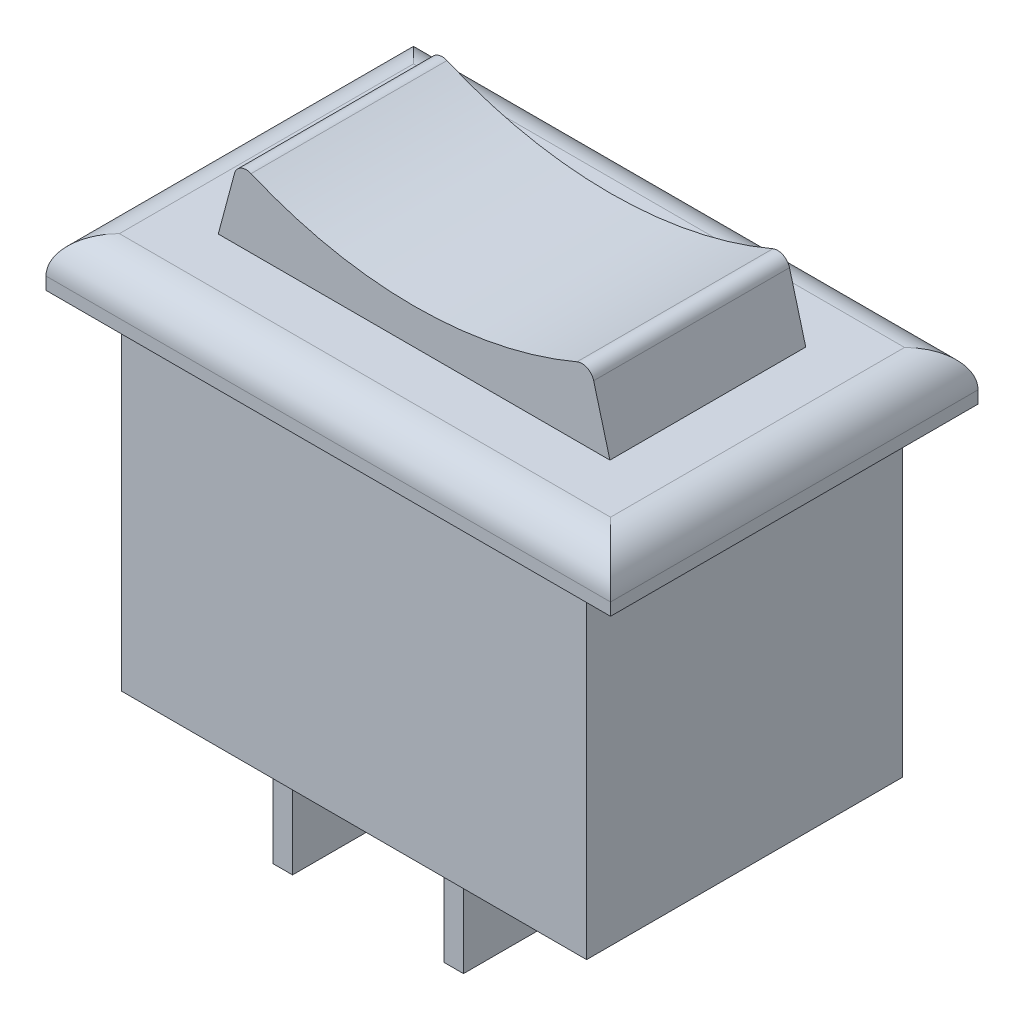
ISO-10303-21;
HEADER;
FILE_DESCRIPTION(('STEP AP214'),'2;1');
FILE_NAME('part.step','',(''),(''),'','','');
FILE_SCHEMA(('AUTOMOTIVE_DESIGN { 1 0 10303 214 1 1 1 1 }'));
ENDSEC;
DATA;
#1=APPLICATION_CONTEXT('core data for automotive mechanical design processes');
#2=APPLICATION_PROTOCOL_DEFINITION('international standard','automotive_design',2000,#1);
#3=PRODUCT_CONTEXT('',#1,'mechanical');
#4=PRODUCT('Part','Part','',(#3));
#5=PRODUCT_RELATED_PRODUCT_CATEGORY('part','',(#4));
#6=PRODUCT_DEFINITION_FORMATION('','',#4);
#7=PRODUCT_DEFINITION_CONTEXT('part definition',#1,'design');
#8=PRODUCT_DEFINITION('design','',#6,#7);
#9=PRODUCT_DEFINITION_SHAPE('','',#8);
#10=(LENGTH_UNIT() NAMED_UNIT(*) SI_UNIT(.MILLI.,.METRE.));
#11=(NAMED_UNIT(*) PLANE_ANGLE_UNIT() SI_UNIT($,.RADIAN.));
#12=(NAMED_UNIT(*) SI_UNIT($,.STERADIAN.) SOLID_ANGLE_UNIT());
#13=UNCERTAINTY_MEASURE_WITH_UNIT(LENGTH_MEASURE(1.E-05),#10,'distance_accuracy_value','');
#14=(GEOMETRIC_REPRESENTATION_CONTEXT(3) GLOBAL_UNCERTAINTY_ASSIGNED_CONTEXT((#13)) GLOBAL_UNIT_ASSIGNED_CONTEXT((#10,
#11,#12)) REPRESENTATION_CONTEXT('',''));
#15=CARTESIAN_POINT('',(0.,0.,0.));
#16=DIRECTION('',(0.,0.,1.));
#17=DIRECTION('',(1.,0.,0.));
#18=AXIS2_PLACEMENT_3D('',#15,#16,#17);
#19=CARTESIAN_POINT('',(0.,0.,15.0114));
#20=DIRECTION('',(1.,0.,0.));
#21=DIRECTION('',(0.,1.,0.));
#22=AXIS2_PLACEMENT_3D('',#19,#20,#21);
#23=PLANE('',#22);
#24=DIRECTION('',(0.,0.,-1.));
#25=VECTOR('',#24,1.);
#26=CARTESIAN_POINT('',(0.,0.,15.0114));
#27=LINE('',#26,#25);
#28=CARTESIAN_POINT('',(0.,0.,13.9573));
#29=VERTEX_POINT('',#28);
#30=CARTESIAN_POINT('',(0.,0.,1.0541));
#31=VERTEX_POINT('',#30);
#32=EDGE_CURVE('E329',#29,#31,#27,.T.);
#33=ORIENTED_EDGE('',*,*,#32,.T.);
#34=DIRECTION('',(0.,-1.,0.));
#35=VECTOR('',#34,1.);
#36=CARTESIAN_POINT('',(0.,0.,1.0541));
#37=LINE('',#36,#35);
#38=CARTESIAN_POINT('',(0.,-13.6906,1.0541));
#39=VERTEX_POINT('',#38);
#40=EDGE_CURVE('E306',#31,#39,#37,.T.);
#41=ORIENTED_EDGE('',*,*,#40,.T.);
#42=DIRECTION('',(0.,0.,-1.));
#43=VECTOR('',#42,1.);
#44=CARTESIAN_POINT('',(0.,-13.6906,15.0114));
#45=LINE('',#44,#43);
#46=CARTESIAN_POINT('',(0.,-13.6906,13.9573));
#47=VERTEX_POINT('',#46);
#48=EDGE_CURVE('E348',#47,#39,#45,.T.);
#49=ORIENTED_EDGE('',*,*,#48,.F.);
#50=DIRECTION('',(0.,1.,0.));
#51=VECTOR('',#50,1.);
#52=CARTESIAN_POINT('',(0.,0.,13.9573));
#53=LINE('',#52,#51);
#54=EDGE_CURVE('E317',#47,#29,#53,.T.);
#55=ORIENTED_EDGE('',*,*,#54,.T.);
#56=EDGE_LOOP('',(#33,#41,#49,#55));
#57=FACE_BOUND('',#56,.T.);
#58=ADVANCED_FACE('F33',(#57),#23,.F.);
#59=CARTESIAN_POINT('',(0.,-13.6906,15.0114));
#60=DIRECTION('',(0.,1.,0.));
#61=DIRECTION('',(0.,0.,1.));
#62=AXIS2_PLACEMENT_3D('',#59,#60,#61);
#63=PLANE('',#62);
#64=DIRECTION('',(-1.,0.,0.));
#65=VECTOR('',#64,1.);
#66=CARTESIAN_POINT('',(21.0312,-13.6906,9.8806));
#67=LINE('',#66,#65);
#68=CARTESIAN_POINT('',(9.8933,-13.6906,9.8806));
#69=VERTEX_POINT('',#68);
#70=CARTESIAN_POINT('',(9.1059,-13.6906,9.8806));
#71=VERTEX_POINT('',#70);
#72=EDGE_CURVE('E249',#69,#71,#67,.T.);
#73=ORIENTED_EDGE('',*,*,#72,.F.);
#74=DIRECTION('',(0.,0.,1.));
#75=VECTOR('',#74,1.);
#76=CARTESIAN_POINT('',(9.8933,-13.6906,-6.0761102577694));
#77=LINE('',#76,#75);
#78=CARTESIAN_POINT('',(9.8933,-13.6906,5.1308));
#79=VERTEX_POINT('',#78);
#80=EDGE_CURVE('E277',#79,#69,#77,.T.);
#81=ORIENTED_EDGE('',*,*,#80,.F.);
#82=DIRECTION('',(-1.,0.,0.));
#83=VECTOR('',#82,1.);
#84=CARTESIAN_POINT('',(21.0312,-13.6906,5.1308));
#85=LINE('',#84,#83);
#86=CARTESIAN_POINT('',(9.1059,-13.6906,5.1308));
#87=VERTEX_POINT('',#86);
#88=EDGE_CURVE('E262',#79,#87,#85,.T.);
#89=ORIENTED_EDGE('',*,*,#88,.T.);
#90=DIRECTION('',(0.,0.,1.));
#91=VECTOR('',#90,1.);
#92=CARTESIAN_POINT('',(9.1059,-13.6906,-6.0761102577694));
#93=LINE('',#92,#91);
#94=EDGE_CURVE('E273',#87,#71,#93,.T.);
#95=ORIENTED_EDGE('',*,*,#94,.T.);
#96=EDGE_LOOP('',(#73,#81,#89,#95));
#97=FACE_BOUND('',#96,.T.);
#98=CARTESIAN_POINT('',(2.9083,-13.6906,9.8806));
#99=VERTEX_POINT('',#98);
#100=CARTESIAN_POINT('',(2.1209,-13.6906,9.8806));
#101=VERTEX_POINT('',#100);
#102=EDGE_CURVE('E237',#99,#101,#67,.T.);
#103=ORIENTED_EDGE('',*,*,#102,.F.);
#104=DIRECTION('',(0.,0.,1.));
#105=VECTOR('',#104,1.);
#106=CARTESIAN_POINT('',(2.9083,-13.6906,-6.0761102577694));
#107=LINE('',#106,#105);
#108=CARTESIAN_POINT('',(2.9083,-13.6906,5.1308));
#109=VERTEX_POINT('',#108);
#110=EDGE_CURVE('E289',#109,#99,#107,.T.);
#111=ORIENTED_EDGE('',*,*,#110,.F.);
#112=CARTESIAN_POINT('',(2.1209,-13.6906,5.1308));
#113=VERTEX_POINT('',#112);
#114=EDGE_CURVE('E259',#109,#113,#85,.T.);
#115=ORIENTED_EDGE('',*,*,#114,.T.);
#116=DIRECTION('',(0.,0.,1.));
#117=VECTOR('',#116,1.);
#118=CARTESIAN_POINT('',(2.1209,-13.6906,-6.0761102577694));
#119=LINE('',#118,#117);
#120=EDGE_CURVE('E285',#113,#101,#119,.T.);
#121=ORIENTED_EDGE('',*,*,#120,.T.);
#122=EDGE_LOOP('',(#103,#111,#115,#121));
#123=FACE_BOUND('',#122,.T.);
#124=DIRECTION('',(1.,0.,0.));
#125=VECTOR('',#124,1.);
#126=CARTESIAN_POINT('',(-2.032,-13.6906,1.0541));
#127=LINE('',#126,#125);
#128=CARTESIAN_POINT('',(18.9992,-13.6906,1.0541));
#129=VERTEX_POINT('',#128);
#130=EDGE_CURVE('E297',#39,#129,#127,.T.);
#131=ORIENTED_EDGE('',*,*,#130,.T.);
#132=DIRECTION('',(0.,0.,-1.));
#133=VECTOR('',#132,1.);
#134=CARTESIAN_POINT('',(18.9992,-13.6906,15.0114));
#135=LINE('',#134,#133);
#136=CARTESIAN_POINT('',(18.9992,-13.6906,13.9573));
#137=VERTEX_POINT('',#136);
#138=EDGE_CURVE('E346',#137,#129,#135,.T.);
#139=ORIENTED_EDGE('',*,*,#138,.F.);
#140=DIRECTION('',(1.,0.,0.));
#141=VECTOR('',#140,1.);
#142=CARTESIAN_POINT('',(-2.032,-13.6906,13.9573));
#143=LINE('',#142,#141);
#144=EDGE_CURVE('E309',#47,#137,#143,.T.);
#145=ORIENTED_EDGE('',*,*,#144,.F.);
#146=ORIENTED_EDGE('',*,*,#48,.T.);
#147=EDGE_LOOP('',(#131,#139,#145,#146));
#148=FACE_BOUND('',#147,.T.);
#149=ADVANCED_FACE('F398',(#97,#123,#148),#63,.F.);
#150=CARTESIAN_POINT('',(18.9992,0.,15.0114));
#151=DIRECTION('',(-1.,0.,0.));
#152=DIRECTION('',(0.,0.,1.));
#153=AXIS2_PLACEMENT_3D('',#150,#151,#152);
#154=PLANE('',#153);
#155=ORIENTED_EDGE('',*,*,#138,.T.);
#156=DIRECTION('',(0.,1.,0.));
#157=VECTOR('',#156,1.);
#158=CARTESIAN_POINT('',(18.9992,0.,1.0541));
#159=LINE('',#158,#157);
#160=CARTESIAN_POINT('',(18.9992,0.,1.0541));
#161=VERTEX_POINT('',#160);
#162=EDGE_CURVE('E300',#129,#161,#159,.T.);
#163=ORIENTED_EDGE('',*,*,#162,.T.);
#164=DIRECTION('',(0.,0.,-1.));
#165=VECTOR('',#164,1.);
#166=CARTESIAN_POINT('',(18.9992,0.,15.0114));
#167=LINE('',#166,#165);
#168=CARTESIAN_POINT('',(18.9992,0.,13.9573));
#169=VERTEX_POINT('',#168);
#170=EDGE_CURVE('E343',#169,#161,#167,.T.);
#171=ORIENTED_EDGE('',*,*,#170,.F.);
#172=DIRECTION('',(0.,-1.,0.));
#173=VECTOR('',#172,1.);
#174=CARTESIAN_POINT('',(18.9992,0.,13.9573));
#175=LINE('',#174,#173);
#176=EDGE_CURVE('E313',#169,#137,#175,.T.);
#177=ORIENTED_EDGE('',*,*,#176,.T.);
#178=EDGE_LOOP('',(#155,#163,#171,#177));
#179=FACE_BOUND('',#178,.T.);
#180=ADVANCED_FACE('F401',(#179),#154,.F.);
#181=CARTESIAN_POINT('',(21.0312,2.0066,15.0114));
#182=DIRECTION('',(-1.,0.,0.));
#183=DIRECTION('',(0.,0.,1.));
#184=AXIS2_PLACEMENT_3D('',#181,#182,#183);
#185=PLANE('',#184);
#186=DIRECTION('',(0.,1.,0.));
#187=VECTOR('',#186,1.);
#188=CARTESIAN_POINT('',(21.0312,2.0066,0.));
#189=LINE('',#188,#187);
#190=CARTESIAN_POINT('',(21.0312,0.,0.));
#191=VERTEX_POINT('',#190);
#192=CARTESIAN_POINT('',(21.0312,0.506599999999999,0.));
#193=VERTEX_POINT('',#192);
#194=EDGE_CURVE('E320',#191,#193,#189,.T.);
#195=ORIENTED_EDGE('',*,*,#194,.T.);
#196=DIRECTION('',(0.,0.,-1.));
#197=VECTOR('',#196,1.);
#198=CARTESIAN_POINT('',(21.0312,0.506599999999998,15.0114));
#199=LINE('',#198,#197);
#200=CARTESIAN_POINT('',(21.0312,0.506599999999999,15.0114));
#201=VERTEX_POINT('',#200);
#202=EDGE_CURVE('E359',#193,#201,#199,.F.);
#203=ORIENTED_EDGE('',*,*,#202,.T.);
#204=DIRECTION('',(0.,1.,0.));
#205=VECTOR('',#204,1.);
#206=CARTESIAN_POINT('',(21.0312,2.0066,15.0114));
#207=LINE('',#206,#205);
#208=CARTESIAN_POINT('',(21.0312,0.,15.0114));
#209=VERTEX_POINT('',#208);
#210=EDGE_CURVE('E323',#209,#201,#207,.T.);
#211=ORIENTED_EDGE('',*,*,#210,.F.);
#212=DIRECTION('',(0.,0.,-1.));
#213=VECTOR('',#212,1.);
#214=CARTESIAN_POINT('',(21.0312,0.,15.0114));
#215=LINE('',#214,#213);
#216=EDGE_CURVE('E341',#209,#191,#215,.T.);
#217=ORIENTED_EDGE('',*,*,#216,.T.);
#218=EDGE_LOOP('',(#195,#203,#211,#217));
#219=FACE_BOUND('',#218,.T.);
#220=ADVANCED_FACE('F467',(#219),#185,.F.);
#221=CARTESIAN_POINT('',(21.0312,2.0066,15.0114));
#222=DIRECTION('',(0.,-1.,0.));
#223=DIRECTION('',(1.,0.,0.));
#224=AXIS2_PLACEMENT_3D('',#221,#222,#223);
#225=PLANE('',#224);
#226=DIRECTION('',(0.,0.,1.));
#227=VECTOR('',#226,1.);
#228=CARTESIAN_POINT('',(1.4996,2.00659999999999,3.5057));
#229=LINE('',#228,#227);
#230=CARTESIAN_POINT('',(1.4996,2.00659999999999,3.5057));
#231=VERTEX_POINT('',#230);
#232=CARTESIAN_POINT('',(1.4996,2.00659999999999,11.5057));
#233=VERTEX_POINT('',#232);
#234=EDGE_CURVE('E48',#231,#233,#229,.T.);
#235=ORIENTED_EDGE('',*,*,#234,.F.);
#236=DIRECTION('',(1.,0.,0.));
#237=VECTOR('',#236,1.);
#238=CARTESIAN_POINT('',(1.4996,2.00659999999999,3.5057));
#239=LINE('',#238,#237);
#240=CARTESIAN_POINT('',(17.4996,2.0066,3.5057));
#241=VERTEX_POINT('',#240);
#242=EDGE_CURVE('E52',#231,#241,#239,.T.);
#243=ORIENTED_EDGE('',*,*,#242,.T.);
#244=DIRECTION('',(0.,0.,1.));
#245=VECTOR('',#244,1.);
#246=CARTESIAN_POINT('',(17.4996,2.00659999999999,3.5057));
#247=LINE('',#246,#245);
#248=CARTESIAN_POINT('',(17.4996,2.00659999999999,11.5057));
#249=VERTEX_POINT('',#248);
#250=EDGE_CURVE('E188',#241,#249,#247,.T.);
#251=ORIENTED_EDGE('',*,*,#250,.T.);
#252=DIRECTION('',(1.,0.,0.));
#253=VECTOR('',#252,1.);
#254=CARTESIAN_POINT('',(1.4996,2.00659999999999,11.5057));
#255=LINE('',#254,#253);
#256=EDGE_CURVE('E193',#233,#249,#255,.T.);
#257=ORIENTED_EDGE('',*,*,#256,.F.);
#258=EDGE_LOOP('',(#235,#243,#251,#257));
#259=FACE_BOUND('',#258,.T.);
#260=DIRECTION('',(-1.,0.,0.));
#261=VECTOR('',#260,1.);
#262=CARTESIAN_POINT('',(21.0312,2.0066,13.5114));
#263=LINE('',#262,#261);
#264=CARTESIAN_POINT('',(-0.531999999999999,2.00659999999999,13.5114));
#265=VERTEX_POINT('',#264);
#266=CARTESIAN_POINT('',(19.5312,2.0066,13.5114));
#267=VERTEX_POINT('',#266);
#268=EDGE_CURVE('E354',#265,#267,#263,.F.);
#269=ORIENTED_EDGE('',*,*,#268,.T.);
#270=DIRECTION('',(0.,0.,-1.));
#271=VECTOR('',#270,1.);
#272=CARTESIAN_POINT('',(19.5312,2.0066,15.0114));
#273=LINE('',#272,#271);
#274=CARTESIAN_POINT('',(19.5312,2.0066,1.5));
#275=VERTEX_POINT('',#274);
#276=EDGE_CURVE('E356',#267,#275,#273,.T.);
#277=ORIENTED_EDGE('',*,*,#276,.T.);
#278=DIRECTION('',(-1.,0.,0.));
#279=VECTOR('',#278,1.);
#280=CARTESIAN_POINT('',(21.0312,2.0066,1.5));
#281=LINE('',#280,#279);
#282=CARTESIAN_POINT('',(-0.531999999999999,2.00659999999999,1.5));
#283=VERTEX_POINT('',#282);
#284=EDGE_CURVE('E350',#275,#283,#281,.T.);
#285=ORIENTED_EDGE('',*,*,#284,.T.);
#286=DIRECTION('',(0.,0.,-1.));
#287=VECTOR('',#286,1.);
#288=CARTESIAN_POINT('',(-0.531999999999998,2.00659999999999,15.0114));
#289=LINE('',#288,#287);
#290=EDGE_CURVE('E352',#283,#265,#289,.F.);
#291=ORIENTED_EDGE('',*,*,#290,.T.);
#292=EDGE_LOOP('',(#269,#277,#285,#291));
#293=FACE_BOUND('',#292,.T.);
#294=ADVANCED_FACE('F190',(#259,#293),#225,.F.);
#295=CARTESIAN_POINT('',(-2.032,2.00659999999999,15.0114));
#296=DIRECTION('',(1.,0.,0.));
#297=DIRECTION('',(0.,0.,-1.));
#298=AXIS2_PLACEMENT_3D('',#295,#296,#297);
#299=PLANE('',#298);
#300=DIRECTION('',(0.,-1.,0.));
#301=VECTOR('',#300,1.);
#302=CARTESIAN_POINT('',(-2.032,2.00659999999999,15.0114));
#303=LINE('',#302,#301);
#304=CARTESIAN_POINT('',(-2.032,0.506599999999992,15.0114));
#305=VERTEX_POINT('',#304);
#306=CARTESIAN_POINT('',(-2.032,0.,15.0114));
#307=VERTEX_POINT('',#306);
#308=EDGE_CURVE('E327',#305,#307,#303,.T.);
#309=ORIENTED_EDGE('',*,*,#308,.F.);
#310=DIRECTION('',(0.,0.,-1.));
#311=VECTOR('',#310,1.);
#312=CARTESIAN_POINT('',(-2.032,0.506599999999992,15.0114));
#313=LINE('',#312,#311);
#314=CARTESIAN_POINT('',(-2.032,0.506599999999992,0.));
#315=VERTEX_POINT('',#314);
#316=EDGE_CURVE('E364',#305,#315,#313,.T.);
#317=ORIENTED_EDGE('',*,*,#316,.T.);
#318=DIRECTION('',(0.,-1.,0.));
#319=VECTOR('',#318,1.);
#320=CARTESIAN_POINT('',(-2.032,2.00659999999999,0.));
#321=LINE('',#320,#319);
#322=CARTESIAN_POINT('',(-2.032,0.,0.));
#323=VERTEX_POINT('',#322);
#324=EDGE_CURVE('E332',#315,#323,#321,.T.);
#325=ORIENTED_EDGE('',*,*,#324,.T.);
#326=DIRECTION('',(0.,0.,-1.));
#327=VECTOR('',#326,1.);
#328=CARTESIAN_POINT('',(-2.032,0.,15.0114));
#329=LINE('',#328,#327);
#330=EDGE_CURVE('E338',#307,#323,#329,.T.);
#331=ORIENTED_EDGE('',*,*,#330,.F.);
#332=EDGE_LOOP('',(#309,#317,#325,#331));
#333=FACE_BOUND('',#332,.T.);
#334=ADVANCED_FACE('F455',(#333),#299,.F.);
#335=CARTESIAN_POINT('',(-2.032,0.,15.0114));
#336=DIRECTION('',(0.,1.,0.));
#337=DIRECTION('',(-1.,0.,0.));
#338=AXIS2_PLACEMENT_3D('',#335,#336,#337);
#339=PLANE('',#338);
#340=DIRECTION('',(1.,0.,0.));
#341=VECTOR('',#340,1.);
#342=CARTESIAN_POINT('',(-2.032,0.,1.0541));
#343=LINE('',#342,#341);
#344=EDGE_CURVE('E301',#31,#161,#343,.T.);
#345=ORIENTED_EDGE('',*,*,#344,.F.);
#346=ORIENTED_EDGE('',*,*,#32,.F.);
#347=DIRECTION('',(1.,0.,0.));
#348=VECTOR('',#347,1.);
#349=CARTESIAN_POINT('',(-2.032,0.,13.9573));
#350=LINE('',#349,#348);
#351=EDGE_CURVE('E310',#29,#169,#350,.T.);
#352=ORIENTED_EDGE('',*,*,#351,.T.);
#353=ORIENTED_EDGE('',*,*,#170,.T.);
#354=EDGE_LOOP('',(#345,#346,#352,#353));
#355=FACE_BOUND('',#354,.T.);
#356=ORIENTED_EDGE('',*,*,#330,.T.);
#357=DIRECTION('',(1.,0.,0.));
#358=VECTOR('',#357,1.);
#359=CARTESIAN_POINT('',(-2.032,0.,0.));
#360=LINE('',#359,#358);
#361=EDGE_CURVE('E324',#323,#191,#360,.T.);
#362=ORIENTED_EDGE('',*,*,#361,.T.);
#363=ORIENTED_EDGE('',*,*,#216,.F.);
#364=DIRECTION('',(1.,0.,0.));
#365=VECTOR('',#364,1.);
#366=CARTESIAN_POINT('',(21.0312,0.,15.0114));
#367=LINE('',#366,#365);
#368=EDGE_CURVE('E321',#307,#209,#367,.T.);
#369=ORIENTED_EDGE('',*,*,#368,.F.);
#370=EDGE_LOOP('',(#356,#362,#363,#369));
#371=FACE_BOUND('',#370,.T.);
#372=ADVANCED_FACE('F417',(#355,#371),#339,.F.);
#373=CARTESIAN_POINT('',(0.,0.,15.0114));
#374=DIRECTION('',(0.,0.,1.));
#375=DIRECTION('',(1.,0.,0.));
#376=AXIS2_PLACEMENT_3D('',#373,#374,#375);
#377=PLANE('',#376);
#378=ORIENTED_EDGE('',*,*,#210,.T.);
#379=DIRECTION('',(-1.,0.,0.));
#380=VECTOR('',#379,1.);
#381=CARTESIAN_POINT('',(-2.032,0.506599999999992,15.0114));
#382=LINE('',#381,#380);
#383=EDGE_CURVE('E362',#201,#305,#382,.T.);
#384=ORIENTED_EDGE('',*,*,#383,.T.);
#385=ORIENTED_EDGE('',*,*,#308,.T.);
#386=ORIENTED_EDGE('',*,*,#368,.T.);
#387=EDGE_LOOP('',(#378,#384,#385,#386));
#388=FACE_BOUND('',#387,.T.);
#389=ADVANCED_FACE('F465',(#388),#377,.T.);
#390=CARTESIAN_POINT('',(0.,0.,0.));
#391=DIRECTION('',(0.,0.,1.));
#392=DIRECTION('',(1.,0.,0.));
#393=AXIS2_PLACEMENT_3D('',#390,#391,#392);
#394=PLANE('',#393);
#395=ORIENTED_EDGE('',*,*,#324,.F.);
#396=DIRECTION('',(-1.,0.,0.));
#397=VECTOR('',#396,1.);
#398=CARTESIAN_POINT('',(0.,0.506599999999993,0.));
#399=LINE('',#398,#397);
#400=EDGE_CURVE('E366',#315,#193,#399,.F.);
#401=ORIENTED_EDGE('',*,*,#400,.T.);
#402=ORIENTED_EDGE('',*,*,#194,.F.);
#403=ORIENTED_EDGE('',*,*,#361,.F.);
#404=EDGE_LOOP('',(#395,#401,#402,#403));
#405=FACE_BOUND('',#404,.T.);
#406=ADVANCED_FACE('F459',(#405),#394,.F.);
#407=CARTESIAN_POINT('',(-2.032,-13.6906,13.9573));
#408=DIRECTION('',(0.,0.,-1.));
#409=DIRECTION('',(-1.,0.,0.));
#410=AXIS2_PLACEMENT_3D('',#407,#408,#409);
#411=PLANE('',#410);
#412=ORIENTED_EDGE('',*,*,#144,.T.);
#413=ORIENTED_EDGE('',*,*,#176,.F.);
#414=ORIENTED_EDGE('',*,*,#351,.F.);
#415=ORIENTED_EDGE('',*,*,#54,.F.);
#416=EDGE_LOOP('',(#412,#413,#414,#415));
#417=FACE_BOUND('',#416,.T.);
#418=ADVANCED_FACE('F421',(#417),#411,.F.);
#419=CARTESIAN_POINT('',(-2.032,-13.6906,1.0541));
#420=DIRECTION('',(0.,0.,1.));
#421=DIRECTION('',(0.,-1.,0.));
#422=AXIS2_PLACEMENT_3D('',#419,#420,#421);
#423=PLANE('',#422);
#424=ORIENTED_EDGE('',*,*,#162,.F.);
#425=ORIENTED_EDGE('',*,*,#130,.F.);
#426=ORIENTED_EDGE('',*,*,#40,.F.);
#427=ORIENTED_EDGE('',*,*,#344,.T.);
#428=EDGE_LOOP('',(#424,#425,#426,#427));
#429=FACE_BOUND('',#428,.T.);
#430=ADVANCED_FACE('F412',(#429),#423,.F.);
#431=CARTESIAN_POINT('',(-0.531999999999999,0.506599999999992,15.0114));
#432=DIRECTION('',(0.,0.,-1.));
#433=DIRECTION('',(-1.,0.,0.));
#434=AXIS2_PLACEMENT_3D('',#431,#432,#433);
#435=CYLINDRICAL_SURFACE('',#434,1.5);
#436=CARTESIAN_POINT('',(-0.531999999999998,0.506599999999992,1.5));
#437=DIRECTION('',(-0.707106781186547,0.,0.707106781186547));
#438=DIRECTION('',(-0.707106781186547,0.,-0.707106781186547));
#439=AXIS2_PLACEMENT_3D('',#436,#437,#438);
#440=ELLIPSE('',#439,2.12132034355964,1.5);
#441=EDGE_CURVE('E371',#315,#283,#440,.F.);
#442=ORIENTED_EDGE('',*,*,#441,.F.);
#443=ORIENTED_EDGE('',*,*,#316,.F.);
#444=CARTESIAN_POINT('',(-0.531999999999999,0.506599999999992,13.5114));
#445=DIRECTION('',(-0.707106781186547,0.,-0.707106781186547));
#446=DIRECTION('',(0.707106781186547,0.,-0.707106781186547));
#447=AXIS2_PLACEMENT_3D('',#444,#445,#446);
#448=ELLIPSE('',#447,2.12132034355964,1.5);
#449=EDGE_CURVE('E303',#265,#305,#448,.F.);
#450=ORIENTED_EDGE('',*,*,#449,.F.);
#451=ORIENTED_EDGE('',*,*,#290,.F.);
#452=EDGE_LOOP('',(#442,#443,#450,#451));
#453=FACE_BOUND('',#452,.T.);
#454=ADVANCED_FACE('F35',(#453),#435,.T.);
#455=CARTESIAN_POINT('',(0.,0.506599999999993,13.5114));
#456=DIRECTION('',(1.,0.,0.));
#457=DIRECTION('',(0.,1.,0.));
#458=AXIS2_PLACEMENT_3D('',#455,#456,#457);
#459=CYLINDRICAL_SURFACE('',#458,1.5);
#460=ORIENTED_EDGE('',*,*,#449,.T.);
#461=ORIENTED_EDGE('',*,*,#383,.F.);
#462=CARTESIAN_POINT('',(19.5312,0.506599999999998,13.5114));
#463=DIRECTION('',(0.707106781186547,0.,-0.707106781186547));
#464=DIRECTION('',(0.707106781186547,0.,0.707106781186547));
#465=AXIS2_PLACEMENT_3D('',#462,#463,#464);
#466=ELLIPSE('',#465,2.12132034355964,1.5);
#467=EDGE_CURVE('E369',#267,#201,#466,.T.);
#468=ORIENTED_EDGE('',*,*,#467,.F.);
#469=ORIENTED_EDGE('',*,*,#268,.F.);
#470=EDGE_LOOP('',(#460,#461,#468,#469));
#471=FACE_BOUND('',#470,.T.);
#472=ADVANCED_FACE('F436',(#471),#459,.T.);
#473=CARTESIAN_POINT('',(21.0312,0.506599999999999,1.5));
#474=DIRECTION('',(-1.,0.,0.));
#475=DIRECTION('',(0.,-1.,0.));
#476=AXIS2_PLACEMENT_3D('',#473,#474,#475);
#477=CYLINDRICAL_SURFACE('',#476,1.5);
#478=ORIENTED_EDGE('',*,*,#441,.T.);
#479=ORIENTED_EDGE('',*,*,#284,.F.);
#480=CARTESIAN_POINT('',(19.5312,0.506599999999998,1.5));
#481=DIRECTION('',(-0.707106781186547,0.,-0.707106781186547));
#482=DIRECTION('',(-0.707106781186547,0.,0.707106781186547));
#483=AXIS2_PLACEMENT_3D('',#480,#481,#482);
#484=ELLIPSE('',#483,2.12132034355964,1.5);
#485=EDGE_CURVE('E288',#193,#275,#484,.F.);
#486=ORIENTED_EDGE('',*,*,#485,.F.);
#487=ORIENTED_EDGE('',*,*,#400,.F.);
#488=EDGE_LOOP('',(#478,#479,#486,#487));
#489=FACE_BOUND('',#488,.T.);
#490=ADVANCED_FACE('F433',(#489),#477,.T.);
#491=CARTESIAN_POINT('',(19.5312,0.506599999999998,15.0114));
#492=DIRECTION('',(0.,0.,-1.));
#493=DIRECTION('',(-1.,0.,0.));
#494=AXIS2_PLACEMENT_3D('',#491,#492,#493);
#495=CYLINDRICAL_SURFACE('',#494,1.5);
#496=ORIENTED_EDGE('',*,*,#467,.T.);
#497=ORIENTED_EDGE('',*,*,#202,.F.);
#498=ORIENTED_EDGE('',*,*,#485,.T.);
#499=ORIENTED_EDGE('',*,*,#276,.F.);
#500=EDGE_LOOP('',(#496,#497,#498,#499));
#501=FACE_BOUND('',#500,.T.);
#502=ADVANCED_FACE('F429',(#501),#495,.T.);
#503=CARTESIAN_POINT('',(2.1209,-13.6906,-6.0761102577694));
#504=DIRECTION('',(-1.,0.,0.));
#505=DIRECTION('',(0.,-1.,0.));
#506=AXIS2_PLACEMENT_3D('',#503,#504,#505);
#507=PLANE('',#506);
#508=DIRECTION('',(0.,-1.,0.));
#509=VECTOR('',#508,1.);
#510=CARTESIAN_POINT('',(2.1209,-13.6906,9.8806));
#511=LINE('',#510,#509);
#512=CARTESIAN_POINT('',(2.1209,-20.7772,9.88059999999999));
#513=VERTEX_POINT('',#512);
#514=EDGE_CURVE('E256',#101,#513,#511,.T.);
#515=ORIENTED_EDGE('',*,*,#514,.F.);
#516=ORIENTED_EDGE('',*,*,#120,.F.);
#517=DIRECTION('',(0.,1.,0.));
#518=VECTOR('',#517,1.);
#519=CARTESIAN_POINT('',(2.1209,-13.6906,5.1308));
#520=LINE('',#519,#518);
#521=CARTESIAN_POINT('',(2.1209,-20.7772,5.1308));
#522=VERTEX_POINT('',#521);
#523=EDGE_CURVE('E270',#522,#113,#520,.T.);
#524=ORIENTED_EDGE('',*,*,#523,.F.);
#525=DIRECTION('',(0.,0.,1.));
#526=VECTOR('',#525,1.);
#527=CARTESIAN_POINT('',(2.1209,-20.7772,-6.0761102577694));
#528=LINE('',#527,#526);
#529=EDGE_CURVE('E276',#522,#513,#528,.T.);
#530=ORIENTED_EDGE('',*,*,#529,.T.);
#531=EDGE_LOOP('',(#515,#516,#524,#530));
#532=FACE_BOUND('',#531,.T.);
#533=ADVANCED_FACE('F432',(#532),#507,.T.);
#534=CARTESIAN_POINT('',(2.9083,-13.6906,-6.0761102577694));
#535=DIRECTION('',(1.,0.,0.));
#536=DIRECTION('',(0.,1.,0.));
#537=AXIS2_PLACEMENT_3D('',#534,#535,#536);
#538=PLANE('',#537);
#539=DIRECTION('',(0.,1.,0.));
#540=VECTOR('',#539,1.);
#541=CARTESIAN_POINT('',(2.9083,-13.6906,9.8806));
#542=LINE('',#541,#540);
#543=CARTESIAN_POINT('',(2.9083,-20.7772,9.8806));
#544=VERTEX_POINT('',#543);
#545=EDGE_CURVE('E254',#544,#99,#542,.T.);
#546=ORIENTED_EDGE('',*,*,#545,.F.);
#547=DIRECTION('',(0.,0.,1.));
#548=VECTOR('',#547,1.);
#549=CARTESIAN_POINT('',(2.9083,-20.7772,-6.0761102577694));
#550=LINE('',#549,#548);
#551=CARTESIAN_POINT('',(2.9083,-20.7772,5.1308));
#552=VERTEX_POINT('',#551);
#553=EDGE_CURVE('E292',#552,#544,#550,.T.);
#554=ORIENTED_EDGE('',*,*,#553,.F.);
#555=DIRECTION('',(0.,-1.,0.));
#556=VECTOR('',#555,1.);
#557=CARTESIAN_POINT('',(2.9083,-13.6906,5.1308));
#558=LINE('',#557,#556);
#559=EDGE_CURVE('E268',#109,#552,#558,.T.);
#560=ORIENTED_EDGE('',*,*,#559,.F.);
#561=ORIENTED_EDGE('',*,*,#110,.T.);
#562=EDGE_LOOP('',(#546,#554,#560,#561));
#563=FACE_BOUND('',#562,.T.);
#564=ADVANCED_FACE('F686',(#563),#538,.T.);
#565=CARTESIAN_POINT('',(2.1209,-20.7772,-6.0761102577694));
#566=DIRECTION('',(0.,-1.,0.));
#567=DIRECTION('',(0.,0.,-1.));
#568=AXIS2_PLACEMENT_3D('',#565,#566,#567);
#569=PLANE('',#568);
#570=DIRECTION('',(-1.,0.,0.));
#571=VECTOR('',#570,1.);
#572=CARTESIAN_POINT('',(21.0312,-20.7772,9.8806));
#573=LINE('',#572,#571);
#574=EDGE_CURVE('E245',#544,#513,#573,.T.);
#575=ORIENTED_EDGE('',*,*,#574,.T.);
#576=ORIENTED_EDGE('',*,*,#529,.F.);
#577=DIRECTION('',(-1.,0.,0.));
#578=VECTOR('',#577,1.);
#579=CARTESIAN_POINT('',(21.0312,-20.7772,5.1308));
#580=LINE('',#579,#578);
#581=EDGE_CURVE('E258',#552,#522,#580,.T.);
#582=ORIENTED_EDGE('',*,*,#581,.F.);
#583=ORIENTED_EDGE('',*,*,#553,.T.);
#584=EDGE_LOOP('',(#575,#576,#582,#583));
#585=FACE_BOUND('',#584,.T.);
#586=ADVANCED_FACE('F679',(#585),#569,.T.);
#587=CARTESIAN_POINT('',(9.1059,-13.6906,-6.0761102577694));
#588=DIRECTION('',(-1.,0.,0.));
#589=DIRECTION('',(0.,0.,1.));
#590=AXIS2_PLACEMENT_3D('',#587,#588,#589);
#591=PLANE('',#590);
#592=DIRECTION('',(0.,-1.,0.));
#593=VECTOR('',#592,1.);
#594=CARTESIAN_POINT('',(9.1059,-13.6906,9.8806));
#595=LINE('',#594,#593);
#596=CARTESIAN_POINT('',(9.1059,-20.7772,9.88059999999999));
#597=VERTEX_POINT('',#596);
#598=EDGE_CURVE('E252',#71,#597,#595,.T.);
#599=ORIENTED_EDGE('',*,*,#598,.F.);
#600=ORIENTED_EDGE('',*,*,#94,.F.);
#601=DIRECTION('',(0.,1.,0.));
#602=VECTOR('',#601,1.);
#603=CARTESIAN_POINT('',(9.1059,-13.6906,5.1308));
#604=LINE('',#603,#602);
#605=CARTESIAN_POINT('',(9.1059,-20.7772,5.1308));
#606=VERTEX_POINT('',#605);
#607=EDGE_CURVE('E266',#606,#87,#604,.T.);
#608=ORIENTED_EDGE('',*,*,#607,.F.);
#609=DIRECTION('',(0.,0.,1.));
#610=VECTOR('',#609,1.);
#611=CARTESIAN_POINT('',(9.1059,-20.7772,-6.0761102577694));
#612=LINE('',#611,#610);
#613=EDGE_CURVE('E272',#606,#597,#612,.T.);
#614=ORIENTED_EDGE('',*,*,#613,.T.);
#615=EDGE_LOOP('',(#599,#600,#608,#614));
#616=FACE_BOUND('',#615,.T.);
#617=ADVANCED_FACE('F387',(#616),#591,.T.);
#618=CARTESIAN_POINT('',(9.8933,-13.6906,-6.0761102577694));
#619=DIRECTION('',(1.,0.,0.));
#620=DIRECTION('',(0.,1.,0.));
#621=AXIS2_PLACEMENT_3D('',#618,#619,#620);
#622=PLANE('',#621);
#623=DIRECTION('',(0.,1.,0.));
#624=VECTOR('',#623,1.);
#625=CARTESIAN_POINT('',(9.8933,-13.6906,9.8806));
#626=LINE('',#625,#624);
#627=CARTESIAN_POINT('',(9.8933,-20.7772,9.8806));
#628=VERTEX_POINT('',#627);
#629=EDGE_CURVE('E248',#628,#69,#626,.T.);
#630=ORIENTED_EDGE('',*,*,#629,.F.);
#631=DIRECTION('',(0.,0.,1.));
#632=VECTOR('',#631,1.);
#633=CARTESIAN_POINT('',(9.8933,-20.7772,-6.0761102577694));
#634=LINE('',#633,#632);
#635=CARTESIAN_POINT('',(9.8933,-20.7772,5.1308));
#636=VERTEX_POINT('',#635);
#637=EDGE_CURVE('E280',#636,#628,#634,.T.);
#638=ORIENTED_EDGE('',*,*,#637,.F.);
#639=DIRECTION('',(0.,-1.,0.));
#640=VECTOR('',#639,1.);
#641=CARTESIAN_POINT('',(9.8933,-13.6906,5.1308));
#642=LINE('',#641,#640);
#643=EDGE_CURVE('E264',#79,#636,#642,.T.);
#644=ORIENTED_EDGE('',*,*,#643,.F.);
#645=ORIENTED_EDGE('',*,*,#80,.T.);
#646=EDGE_LOOP('',(#630,#638,#644,#645));
#647=FACE_BOUND('',#646,.T.);
#648=ADVANCED_FACE('F395',(#647),#622,.T.);
#649=CARTESIAN_POINT('',(9.1059,-20.7772,-6.0761102577694));
#650=DIRECTION('',(0.,-1.,0.));
#651=DIRECTION('',(0.,0.,-1.));
#652=AXIS2_PLACEMENT_3D('',#649,#650,#651);
#653=PLANE('',#652);
#654=DIRECTION('',(1.,0.,0.));
#655=VECTOR('',#654,1.);
#656=CARTESIAN_POINT('',(9.1059,-20.7772,9.8806));
#657=LINE('',#656,#655);
#658=EDGE_CURVE('E11',#597,#628,#657,.T.);
#659=ORIENTED_EDGE('',*,*,#658,.F.);
#660=ORIENTED_EDGE('',*,*,#613,.F.);
#661=DIRECTION('',(-1.,0.,0.));
#662=VECTOR('',#661,1.);
#663=CARTESIAN_POINT('',(9.1059,-20.7772,5.1308));
#664=LINE('',#663,#662);
#665=EDGE_CURVE('E41',#636,#606,#664,.T.);
#666=ORIENTED_EDGE('',*,*,#665,.F.);
#667=ORIENTED_EDGE('',*,*,#637,.T.);
#668=EDGE_LOOP('',(#659,#660,#666,#667));
#669=FACE_BOUND('',#668,.T.);
#670=ADVANCED_FACE('F389',(#669),#653,.T.);
#671=CARTESIAN_POINT('',(21.0312,-13.6906,5.1308));
#672=DIRECTION('',(0.,0.,1.));
#673=DIRECTION('',(1.,0.,0.));
#674=AXIS2_PLACEMENT_3D('',#671,#672,#673);
#675=PLANE('',#674);
#676=ORIENTED_EDGE('',*,*,#607,.T.);
#677=ORIENTED_EDGE('',*,*,#88,.F.);
#678=ORIENTED_EDGE('',*,*,#643,.T.);
#679=ORIENTED_EDGE('',*,*,#665,.T.);
#680=EDGE_LOOP('',(#676,#677,#678,#679));
#681=FACE_BOUND('',#680,.T.);
#682=ADVANCED_FACE('F378',(#681),#675,.F.);
#683=ORIENTED_EDGE('',*,*,#523,.T.);
#684=ORIENTED_EDGE('',*,*,#114,.F.);
#685=ORIENTED_EDGE('',*,*,#559,.T.);
#686=ORIENTED_EDGE('',*,*,#581,.T.);
#687=EDGE_LOOP('',(#683,#684,#685,#686));
#688=FACE_BOUND('',#687,.T.);
#689=ADVANCED_FACE('F570',(#688),#675,.F.);
#690=CARTESIAN_POINT('',(21.0312,-13.6906,9.8806));
#691=DIRECTION('',(0.,0.,-1.));
#692=DIRECTION('',(-1.,0.,0.));
#693=AXIS2_PLACEMENT_3D('',#690,#691,#692);
#694=PLANE('',#693);
#695=ORIENTED_EDGE('',*,*,#598,.T.);
#696=ORIENTED_EDGE('',*,*,#658,.T.);
#697=ORIENTED_EDGE('',*,*,#629,.T.);
#698=ORIENTED_EDGE('',*,*,#72,.T.);
#699=EDGE_LOOP('',(#695,#696,#697,#698));
#700=FACE_BOUND('',#699,.T.);
#701=ADVANCED_FACE('F392',(#700),#694,.F.);
#702=ORIENTED_EDGE('',*,*,#514,.T.);
#703=ORIENTED_EDGE('',*,*,#574,.F.);
#704=ORIENTED_EDGE('',*,*,#545,.T.);
#705=ORIENTED_EDGE('',*,*,#102,.T.);
#706=EDGE_LOOP('',(#702,#703,#704,#705));
#707=FACE_BOUND('',#706,.T.);
#708=ADVANCED_FACE('F586',(#707),#694,.F.);
#709=CARTESIAN_POINT('',(2.16330472906139,4.48357977008082,3.5057));
#710=DIRECTION('',(-0.965925826289067,0.258819045102525,0.));
#711=DIRECTION('',(-0.258819045102525,-0.965925826289067,0.));
#712=AXIS2_PLACEMENT_3D('',#709,#710,#711);
#713=PLANE('',#712);
#714=ORIENTED_EDGE('',*,*,#234,.T.);
#715=DIRECTION('',(-0.258819045102525,-0.965925826289067,0.));
#716=VECTOR('',#715,1.);
#717=CARTESIAN_POINT('',(2.16330472906139,4.48357977008082,11.5057));
#718=LINE('',#717,#716);
#719=CARTESIAN_POINT('',(2.16330472906139,4.48357977008082,11.5057));
#720=VERTEX_POINT('',#719);
#721=EDGE_CURVE('E212',#720,#233,#718,.T.);
#722=ORIENTED_EDGE('',*,*,#721,.F.);
#723=DIRECTION('',(0.,0.,1.));
#724=VECTOR('',#723,1.);
#725=CARTESIAN_POINT('',(2.16330472906139,4.48357977008082,3.5057));
#726=LINE('',#725,#724);
#727=CARTESIAN_POINT('',(2.16330472906139,4.48357977008082,3.5057));
#728=VERTEX_POINT('',#727);
#729=EDGE_CURVE('E238',#728,#720,#726,.T.);
#730=ORIENTED_EDGE('',*,*,#729,.F.);
#731=DIRECTION('',(-0.258819045102525,-0.965925826289067,0.));
#732=VECTOR('',#731,1.);
#733=CARTESIAN_POINT('',(2.16330472906139,4.48357977008082,3.5057));
#734=LINE('',#733,#732);
#735=EDGE_CURVE('E198',#728,#231,#734,.T.);
#736=ORIENTED_EDGE('',*,*,#735,.T.);
#737=EDGE_LOOP('',(#714,#722,#730,#736));
#738=FACE_BOUND('',#737,.T.);
#739=ADVANCED_FACE('F594',(#738),#713,.T.);
#740=CARTESIAN_POINT('',(2.64626764220593,4.35417024752956,3.5057));
#741=DIRECTION('',(0.,0.,1.));
#742=DIRECTION('',(1.,0.,0.));
#743=AXIS2_PLACEMENT_3D('',#740,#741,#742);
#744=CYLINDRICAL_SURFACE('',#743,0.500000000000001);
#745=ORIENTED_EDGE('',*,*,#729,.T.);
#746=CARTESIAN_POINT('',(2.64626764220593,4.35417024752956,11.5057));
#747=DIRECTION('',(0.,0.,1.));
#748=DIRECTION('',(1.,0.,0.));
#749=AXIS2_PLACEMENT_3D('',#746,#747,#748);
#750=CIRCLE('',#749,0.500000000000001);
#751=CARTESIAN_POINT('',(2.8420771381429,4.81423398365849,11.5057));
#752=VERTEX_POINT('',#751);
#753=EDGE_CURVE('E219',#752,#720,#750,.T.);
#754=ORIENTED_EDGE('',*,*,#753,.F.);
#755=DIRECTION('',(0.,0.,1.));
#756=VECTOR('',#755,1.);
#757=CARTESIAN_POINT('',(2.8420771381429,4.81423398365849,3.5057));
#758=LINE('',#757,#756);
#759=CARTESIAN_POINT('',(2.8420771381429,4.81423398365849,3.5057));
#760=VERTEX_POINT('',#759);
#761=EDGE_CURVE('E240',#760,#752,#758,.T.);
#762=ORIENTED_EDGE('',*,*,#761,.F.);
#763=CARTESIAN_POINT('',(2.64626764220593,4.35417024752956,3.5057));
#764=DIRECTION('',(0.,0.,1.));
#765=DIRECTION('',(1.,0.,0.));
#766=AXIS2_PLACEMENT_3D('',#763,#764,#765);
#767=CIRCLE('',#766,0.500000000000001);
#768=EDGE_CURVE('E231',#760,#728,#767,.T.);
#769=ORIENTED_EDGE('',*,*,#768,.T.);
#770=EDGE_LOOP('',(#745,#754,#762,#769));
#771=FACE_BOUND('',#770,.T.);
#772=ADVANCED_FACE('F602',(#771),#744,.T.);
#773=CARTESIAN_POINT('',(9.4996,20.4564010120421,3.5057));
#774=DIRECTION('',(0.,0.,1.));
#775=DIRECTION('',(1.,0.,0.));
#776=AXIS2_PLACEMENT_3D('',#773,#774,#775);
#777=CYLINDRICAL_SURFACE('',#776,17.);
#778=ORIENTED_EDGE('',*,*,#761,.T.);
#779=CARTESIAN_POINT('',(9.4996,20.4564010120421,11.5057));
#780=DIRECTION('',(0.,0.,-1.));
#781=DIRECTION('',(1.,0.,0.));
#782=AXIS2_PLACEMENT_3D('',#779,#780,#781);
#783=CIRCLE('',#782,17.);
#784=CARTESIAN_POINT('',(16.1571228618571,4.81423398365849,11.5057));
#785=VERTEX_POINT('',#784);
#786=EDGE_CURVE('E216',#785,#752,#783,.T.);
#787=ORIENTED_EDGE('',*,*,#786,.F.);
#788=DIRECTION('',(0.,0.,1.));
#789=VECTOR('',#788,1.);
#790=CARTESIAN_POINT('',(16.1571228618571,4.81423398365849,3.5057));
#791=LINE('',#790,#789);
#792=CARTESIAN_POINT('',(16.1571228618571,4.81423398365849,3.5057));
#793=VERTEX_POINT('',#792);
#794=EDGE_CURVE('E242',#793,#785,#791,.T.);
#795=ORIENTED_EDGE('',*,*,#794,.F.);
#796=CARTESIAN_POINT('',(9.4996,20.4564010120421,3.5057));
#797=DIRECTION('',(0.,0.,-1.));
#798=DIRECTION('',(1.,0.,0.));
#799=AXIS2_PLACEMENT_3D('',#796,#797,#798);
#800=CIRCLE('',#799,17.);
#801=EDGE_CURVE('E228',#793,#760,#800,.T.);
#802=ORIENTED_EDGE('',*,*,#801,.T.);
#803=EDGE_LOOP('',(#778,#787,#795,#802));
#804=FACE_BOUND('',#803,.T.);
#805=ADVANCED_FACE('F611',(#804),#777,.F.);
#806=CARTESIAN_POINT('',(16.3529323577941,4.35417024752957,3.5057));
#807=DIRECTION('',(0.,0.,1.));
#808=DIRECTION('',(1.,0.,0.));
#809=AXIS2_PLACEMENT_3D('',#806,#807,#808);
#810=CYLINDRICAL_SURFACE('',#809,0.5);
#811=ORIENTED_EDGE('',*,*,#794,.T.);
#812=CARTESIAN_POINT('',(16.3529323577941,4.35417024752957,11.5057));
#813=DIRECTION('',(0.,0.,1.));
#814=DIRECTION('',(-1.,0.,0.));
#815=AXIS2_PLACEMENT_3D('',#812,#813,#814);
#816=CIRCLE('',#815,0.5);
#817=CARTESIAN_POINT('',(16.8358952709386,4.48357977008083,11.5057));
#818=VERTEX_POINT('',#817);
#819=EDGE_CURVE('E206',#818,#785,#816,.T.);
#820=ORIENTED_EDGE('',*,*,#819,.F.);
#821=DIRECTION('',(0.,0.,1.));
#822=VECTOR('',#821,1.);
#823=CARTESIAN_POINT('',(16.8358952709386,4.48357977008083,3.5057));
#824=LINE('',#823,#822);
#825=CARTESIAN_POINT('',(16.8358952709386,4.48357977008083,3.5057));
#826=VERTEX_POINT('',#825);
#827=EDGE_CURVE('E197',#826,#818,#824,.T.);
#828=ORIENTED_EDGE('',*,*,#827,.F.);
#829=CARTESIAN_POINT('',(16.3529323577941,4.35417024752957,3.5057));
#830=DIRECTION('',(0.,0.,1.));
#831=DIRECTION('',(-1.,0.,0.));
#832=AXIS2_PLACEMENT_3D('',#829,#830,#831);
#833=CIRCLE('',#832,0.5);
#834=EDGE_CURVE('E225',#826,#793,#833,.T.);
#835=ORIENTED_EDGE('',*,*,#834,.T.);
#836=EDGE_LOOP('',(#811,#820,#828,#835));
#837=FACE_BOUND('',#836,.T.);
#838=ADVANCED_FACE('F620',(#837),#810,.T.);
#839=CARTESIAN_POINT('',(16.8358952709386,4.48357977008083,3.5057));
#840=DIRECTION('',(0.965925826289069,0.258819045102519,0.));
#841=DIRECTION('',(-0.258819045102519,0.965925826289069,0.));
#842=AXIS2_PLACEMENT_3D('',#839,#840,#841);
#843=PLANE('',#842);
#844=ORIENTED_EDGE('',*,*,#827,.T.);
#845=DIRECTION('',(-0.258819045102519,0.965925826289069,0.));
#846=VECTOR('',#845,1.);
#847=CARTESIAN_POINT('',(16.8358952709386,4.48357977008083,11.5057));
#848=LINE('',#847,#846);
#849=EDGE_CURVE('E201',#249,#818,#848,.T.);
#850=ORIENTED_EDGE('',*,*,#849,.F.);
#851=ORIENTED_EDGE('',*,*,#250,.F.);
#852=DIRECTION('',(-0.258819045102519,0.965925826289069,0.));
#853=VECTOR('',#852,1.);
#854=CARTESIAN_POINT('',(16.8358952709386,4.48357977008083,3.5057));
#855=LINE('',#854,#853);
#856=EDGE_CURVE('E223',#241,#826,#855,.T.);
#857=ORIENTED_EDGE('',*,*,#856,.T.);
#858=EDGE_LOOP('',(#844,#850,#851,#857));
#859=FACE_BOUND('',#858,.T.);
#860=ADVANCED_FACE('F202',(#859),#843,.T.);
#861=CARTESIAN_POINT('',(16.3529323577941,4.35417024752957,3.5057));
#862=DIRECTION('',(0.,0.,-1.));
#863=DIRECTION('',(-1.,0.,0.));
#864=AXIS2_PLACEMENT_3D('',#861,#862,#863);
#865=PLANE('',#864);
#866=ORIENTED_EDGE('',*,*,#242,.F.);
#867=ORIENTED_EDGE('',*,*,#735,.F.);
#868=ORIENTED_EDGE('',*,*,#768,.F.);
#869=ORIENTED_EDGE('',*,*,#801,.F.);
#870=ORIENTED_EDGE('',*,*,#834,.F.);
#871=ORIENTED_EDGE('',*,*,#856,.F.);
#872=EDGE_LOOP('',(#866,#867,#868,#869,#870,#871));
#873=FACE_BOUND('',#872,.T.);
#874=ADVANCED_FACE('F637',(#873),#865,.T.);
#875=CARTESIAN_POINT('',(16.3529323577941,4.35417024752957,11.5057));
#876=DIRECTION('',(0.,0.,-1.));
#877=DIRECTION('',(-1.,0.,0.));
#878=AXIS2_PLACEMENT_3D('',#875,#876,#877);
#879=PLANE('',#878);
#880=ORIENTED_EDGE('',*,*,#256,.T.);
#881=ORIENTED_EDGE('',*,*,#849,.T.);
#882=ORIENTED_EDGE('',*,*,#819,.T.);
#883=ORIENTED_EDGE('',*,*,#786,.T.);
#884=ORIENTED_EDGE('',*,*,#753,.T.);
#885=ORIENTED_EDGE('',*,*,#721,.T.);
#886=EDGE_LOOP('',(#880,#881,#882,#883,#884,#885));
#887=FACE_BOUND('',#886,.T.);
#888=ADVANCED_FACE('F209',(#887),#879,.F.);
#889=CLOSED_SHELL('',(#58,#149,#180,#220,#294,#334,#372,#389,#406,#418,#430,#454,#472,#490,#502,
#533,#564,#586,#617,#648,#670,#682,#689,#701,#708,#739,#772,#805,#838,#860,#874,#888));
#890=MANIFOLD_SOLID_BREP('B2',#889);
#891=ADVANCED_BREP_SHAPE_REPRESENTATION('',(#18,#890),#14);
#892=SHAPE_DEFINITION_REPRESENTATION(#9,#891);
ENDSEC;
END-ISO-10303-21;
